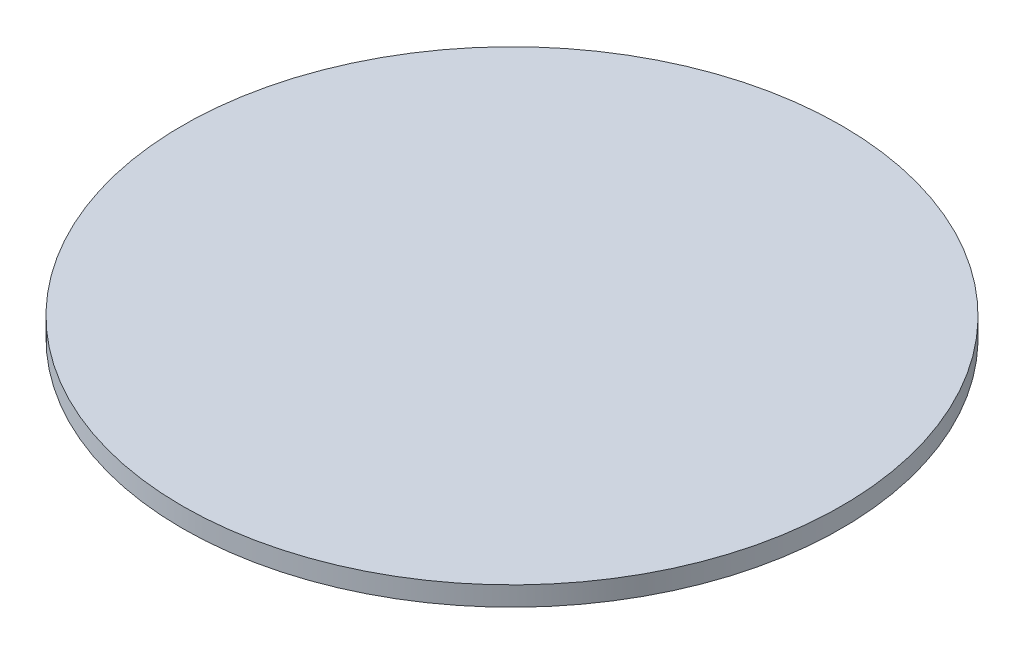
ISO-10303-21;
HEADER;
FILE_DESCRIPTION(('STEP AP214'),'2;1');
FILE_NAME('part.step','',(''),(''),'','','');
FILE_SCHEMA(('AUTOMOTIVE_DESIGN { 1 0 10303 214 1 1 1 1 }'));
ENDSEC;
DATA;
#1=APPLICATION_CONTEXT('core data for automotive mechanical design processes');
#2=APPLICATION_PROTOCOL_DEFINITION('international standard','automotive_design',2000,#1);
#3=PRODUCT_CONTEXT('',#1,'mechanical');
#4=PRODUCT('Part','Part','',(#3));
#5=PRODUCT_RELATED_PRODUCT_CATEGORY('part','',(#4));
#6=PRODUCT_DEFINITION_FORMATION('','',#4);
#7=PRODUCT_DEFINITION_CONTEXT('part definition',#1,'design');
#8=PRODUCT_DEFINITION('design','',#6,#7);
#9=PRODUCT_DEFINITION_SHAPE('','',#8);
#10=(LENGTH_UNIT() NAMED_UNIT(*) SI_UNIT(.MILLI.,.METRE.));
#11=(NAMED_UNIT(*) PLANE_ANGLE_UNIT() SI_UNIT($,.RADIAN.));
#12=(NAMED_UNIT(*) SI_UNIT($,.STERADIAN.) SOLID_ANGLE_UNIT());
#13=UNCERTAINTY_MEASURE_WITH_UNIT(LENGTH_MEASURE(1.E-05),#10,'distance_accuracy_value','');
#14=(GEOMETRIC_REPRESENTATION_CONTEXT(3) GLOBAL_UNCERTAINTY_ASSIGNED_CONTEXT((#13)) GLOBAL_UNIT_ASSIGNED_CONTEXT((#10,
#11,#12)) REPRESENTATION_CONTEXT('',''));
#15=CARTESIAN_POINT('',(0.,0.,0.));
#16=DIRECTION('',(0.,0.,1.));
#17=DIRECTION('',(1.,0.,0.));
#18=AXIS2_PLACEMENT_3D('',#15,#16,#17);
#19=CARTESIAN_POINT('',(22.3156550714144,-47.3015149587838,624.040270184876));
#20=DIRECTION('',(0.,1.,0.));
#21=DIRECTION('',(0.,0.,1.));
#22=AXIS2_PLACEMENT_3D('',#19,#20,#21);
#23=CYLINDRICAL_SURFACE('',#22,34.);
#24=CARTESIAN_POINT('',(22.3156550714144,-47.3015149587838,624.040270184876));
#25=DIRECTION('',(0.,-1.,0.));
#26=DIRECTION('',(0.,0.,-1.));
#27=AXIS2_PLACEMENT_3D('',#24,#25,#26);
#28=CIRCLE('',#27,34.);
#29=CARTESIAN_POINT('',(22.3156550714144,-47.3015149587838,590.040270184876));
#30=VERTEX_POINT('',#29);
#31=EDGE_CURVE('E10',#30,#30,#28,.T.);
#32=ORIENTED_EDGE('',*,*,#31,.F.);
#33=EDGE_LOOP('',(#32));
#34=FACE_BOUND('',#33,.T.);
#35=CARTESIAN_POINT('',(22.3156550714144,-45.3015149587838,624.040270184876));
#36=DIRECTION('',(0.,-1.,0.));
#37=DIRECTION('',(0.,0.,-1.));
#38=AXIS2_PLACEMENT_3D('',#35,#36,#37);
#39=CIRCLE('',#38,34.);
#40=CARTESIAN_POINT('',(22.3156550714144,-45.3015149587838,590.040270184876));
#41=VERTEX_POINT('',#40);
#42=EDGE_CURVE('E35',#41,#41,#39,.T.);
#43=ORIENTED_EDGE('',*,*,#42,.T.);
#44=EDGE_LOOP('',(#43));
#45=FACE_BOUND('',#44,.T.);
#46=ADVANCED_FACE('F32',(#34,#45),#23,.T.);
#47=CARTESIAN_POINT('',(22.3156550714144,-47.3015149587838,624.040270184876));
#48=DIRECTION('',(0.,-1.,0.));
#49=DIRECTION('',(0.,0.,-1.));
#50=AXIS2_PLACEMENT_3D('',#47,#48,#49);
#51=PLANE('',#50);
#52=ORIENTED_EDGE('',*,*,#31,.T.);
#53=EDGE_LOOP('',(#52));
#54=FACE_BOUND('',#53,.T.);
#55=ADVANCED_FACE('F47',(#54),#51,.T.);
#56=CARTESIAN_POINT('',(22.3156550714144,-45.3015149587838,624.040270184876));
#57=DIRECTION('',(0.,-1.,0.));
#58=DIRECTION('',(0.,0.,-1.));
#59=AXIS2_PLACEMENT_3D('',#56,#57,#58);
#60=PLANE('',#59);
#61=ORIENTED_EDGE('',*,*,#42,.F.);
#62=EDGE_LOOP('',(#61));
#63=FACE_BOUND('',#62,.T.);
#64=ADVANCED_FACE('F45',(#63),#60,.F.);
#65=CLOSED_SHELL('',(#46,#55,#64));
#66=MANIFOLD_SOLID_BREP('B2',#65);
#67=ADVANCED_BREP_SHAPE_REPRESENTATION('',(#18,#66),#14);
#68=SHAPE_DEFINITION_REPRESENTATION(#9,#67);
ENDSEC;
END-ISO-10303-21;
